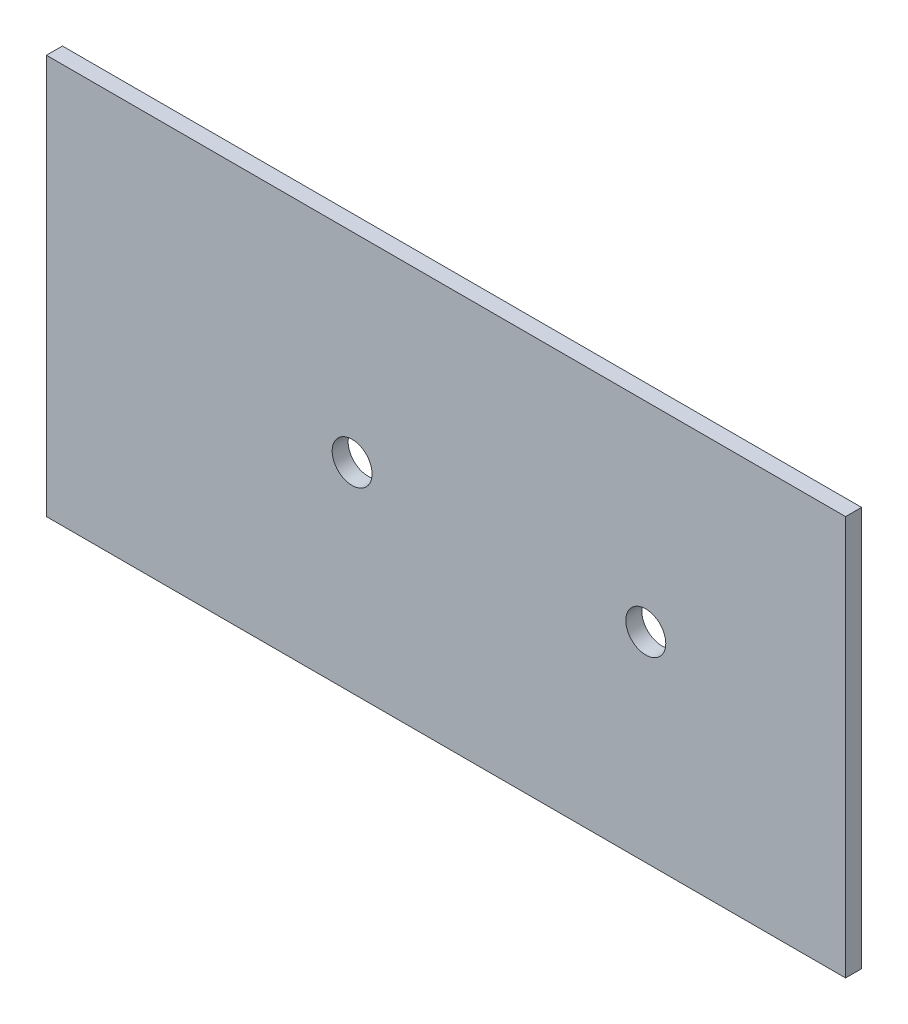
ISO-10303-21;
HEADER;
FILE_DESCRIPTION(('STEP AP214'),'2;1');
FILE_NAME('part.step','',(''),(''),'','','');
FILE_SCHEMA(('AUTOMOTIVE_DESIGN { 1 0 10303 214 1 1 1 1 }'));
ENDSEC;
DATA;
#1=APPLICATION_CONTEXT('core data for automotive mechanical design processes');
#2=APPLICATION_PROTOCOL_DEFINITION('international standard','automotive_design',2000,#1);
#3=PRODUCT_CONTEXT('',#1,'mechanical');
#4=PRODUCT('Part','Part','',(#3));
#5=PRODUCT_RELATED_PRODUCT_CATEGORY('part','',(#4));
#6=PRODUCT_DEFINITION_FORMATION('','',#4);
#7=PRODUCT_DEFINITION_CONTEXT('part definition',#1,'design');
#8=PRODUCT_DEFINITION('design','',#6,#7);
#9=PRODUCT_DEFINITION_SHAPE('','',#8);
#10=(LENGTH_UNIT() NAMED_UNIT(*) SI_UNIT(.MILLI.,.METRE.));
#11=(NAMED_UNIT(*) PLANE_ANGLE_UNIT() SI_UNIT($,.RADIAN.));
#12=(NAMED_UNIT(*) SI_UNIT($,.STERADIAN.) SOLID_ANGLE_UNIT());
#13=UNCERTAINTY_MEASURE_WITH_UNIT(LENGTH_MEASURE(1.E-05),#10,'distance_accuracy_value','');
#14=(GEOMETRIC_REPRESENTATION_CONTEXT(3) GLOBAL_UNCERTAINTY_ASSIGNED_CONTEXT((#13)) GLOBAL_UNIT_ASSIGNED_CONTEXT((#10,
#11,#12)) REPRESENTATION_CONTEXT('',''));
#15=CARTESIAN_POINT('',(0.,0.,0.));
#16=DIRECTION('',(0.,0.,1.));
#17=DIRECTION('',(1.,0.,0.));
#18=AXIS2_PLACEMENT_3D('',#15,#16,#17);
#19=CARTESIAN_POINT('',(0.,0.,4.));
#20=DIRECTION('',(0.,0.,-1.));
#21=DIRECTION('',(-1.,0.,0.));
#22=AXIS2_PLACEMENT_3D('',#19,#20,#21);
#23=PLANE('',#22);
#24=DIRECTION('',(0.,1.,0.));
#25=VECTOR('',#24,1.);
#26=CARTESIAN_POINT('',(50.,-50.,4.));
#27=LINE('',#26,#25);
#28=CARTESIAN_POINT('',(50.,-50.,4.));
#29=VERTEX_POINT('',#28);
#30=CARTESIAN_POINT('',(50.,50.,4.));
#31=VERTEX_POINT('',#30);
#32=EDGE_CURVE('E85',#29,#31,#27,.T.);
#33=ORIENTED_EDGE('',*,*,#32,.T.);
#34=DIRECTION('',(-1.,0.,0.));
#35=VECTOR('',#34,1.);
#36=CARTESIAN_POINT('',(-150.,50.,4.));
#37=LINE('',#36,#35);
#38=CARTESIAN_POINT('',(-150.,50.,4.));
#39=VERTEX_POINT('',#38);
#40=EDGE_CURVE('E80',#31,#39,#37,.T.);
#41=ORIENTED_EDGE('',*,*,#40,.T.);
#42=DIRECTION('',(0.,-1.,0.));
#43=VECTOR('',#42,1.);
#44=CARTESIAN_POINT('',(-150.,-50.,4.));
#45=LINE('',#44,#43);
#46=CARTESIAN_POINT('',(-150.,-50.,4.));
#47=VERTEX_POINT('',#46);
#48=EDGE_CURVE('E83',#39,#47,#45,.T.);
#49=ORIENTED_EDGE('',*,*,#48,.T.);
#50=DIRECTION('',(1.,0.,0.));
#51=VECTOR('',#50,1.);
#52=CARTESIAN_POINT('',(-150.,-50.,4.));
#53=LINE('',#52,#51);
#54=EDGE_CURVE('E50',#47,#29,#53,.T.);
#55=ORIENTED_EDGE('',*,*,#54,.T.);
#56=EDGE_LOOP('',(#33,#41,#49,#55));
#57=FACE_BOUND('',#56,.T.);
#58=CARTESIAN_POINT('',(0.,0.,4.));
#59=DIRECTION('',(0.,0.,1.));
#60=DIRECTION('',(1.,0.,0.));
#61=AXIS2_PLACEMENT_3D('',#58,#59,#60);
#62=CIRCLE('',#61,5.);
#63=CARTESIAN_POINT('',(5.,0.,4.));
#64=VERTEX_POINT('',#63);
#65=EDGE_CURVE('E100',#64,#64,#62,.T.);
#66=ORIENTED_EDGE('',*,*,#65,.F.);
#67=EDGE_LOOP('',(#66));
#68=FACE_BOUND('',#67,.T.);
#69=CARTESIAN_POINT('',(-73.5,0.,4.));
#70=DIRECTION('',(0.,0.,1.));
#71=DIRECTION('',(1.,0.,0.));
#72=AXIS2_PLACEMENT_3D('',#69,#70,#71);
#73=CIRCLE('',#72,5.);
#74=CARTESIAN_POINT('',(-68.5,0.,4.));
#75=VERTEX_POINT('',#74);
#76=EDGE_CURVE('E115',#75,#75,#73,.T.);
#77=ORIENTED_EDGE('',*,*,#76,.F.);
#78=EDGE_LOOP('',(#77));
#79=FACE_BOUND('',#78,.T.);
#80=ADVANCED_FACE('F33',(#57,#68,#79),#23,.F.);
#81=CARTESIAN_POINT('',(0.,0.,0.));
#82=DIRECTION('',(0.,0.,-1.));
#83=DIRECTION('',(-1.,0.,0.));
#84=AXIS2_PLACEMENT_3D('',#81,#82,#83);
#85=PLANE('',#84);
#86=CARTESIAN_POINT('',(0.,0.,0.));
#87=DIRECTION('',(0.,0.,1.));
#88=DIRECTION('',(1.,0.,0.));
#89=AXIS2_PLACEMENT_3D('',#86,#87,#88);
#90=CIRCLE('',#89,5.);
#91=CARTESIAN_POINT('',(5.,0.,0.));
#92=VERTEX_POINT('',#91);
#93=EDGE_CURVE('E112',#92,#92,#90,.T.);
#94=ORIENTED_EDGE('',*,*,#93,.T.);
#95=EDGE_LOOP('',(#94));
#96=FACE_BOUND('',#95,.T.);
#97=DIRECTION('',(0.,1.,0.));
#98=VECTOR('',#97,1.);
#99=CARTESIAN_POINT('',(50.,-50.,0.));
#100=LINE('',#99,#98);
#101=CARTESIAN_POINT('',(50.,-50.,0.));
#102=VERTEX_POINT('',#101);
#103=CARTESIAN_POINT('',(50.,50.,0.));
#104=VERTEX_POINT('',#103);
#105=EDGE_CURVE('E97',#102,#104,#100,.T.);
#106=ORIENTED_EDGE('',*,*,#105,.F.);
#107=DIRECTION('',(1.,0.,0.));
#108=VECTOR('',#107,1.);
#109=CARTESIAN_POINT('',(-150.,-50.,0.));
#110=LINE('',#109,#108);
#111=CARTESIAN_POINT('',(-150.,-50.,0.));
#112=VERTEX_POINT('',#111);
#113=EDGE_CURVE('E73',#112,#102,#110,.T.);
#114=ORIENTED_EDGE('',*,*,#113,.F.);
#115=DIRECTION('',(0.,-1.,0.));
#116=VECTOR('',#115,1.);
#117=CARTESIAN_POINT('',(-150.,-50.,0.));
#118=LINE('',#117,#116);
#119=CARTESIAN_POINT('',(-150.,50.,0.));
#120=VERTEX_POINT('',#119);
#121=EDGE_CURVE('E67',#120,#112,#118,.T.);
#122=ORIENTED_EDGE('',*,*,#121,.F.);
#123=DIRECTION('',(-1.,0.,0.));
#124=VECTOR('',#123,1.);
#125=CARTESIAN_POINT('',(-150.,50.,0.));
#126=LINE('',#125,#124);
#127=EDGE_CURVE('E89',#104,#120,#126,.T.);
#128=ORIENTED_EDGE('',*,*,#127,.F.);
#129=EDGE_LOOP('',(#106,#114,#122,#128));
#130=FACE_BOUND('',#129,.T.);
#131=CARTESIAN_POINT('',(-73.5,0.,0.));
#132=DIRECTION('',(0.,0.,1.));
#133=DIRECTION('',(1.,0.,0.));
#134=AXIS2_PLACEMENT_3D('',#131,#132,#133);
#135=CIRCLE('',#134,5.);
#136=CARTESIAN_POINT('',(-68.5,0.,0.));
#137=VERTEX_POINT('',#136);
#138=EDGE_CURVE('E118',#137,#137,#135,.T.);
#139=ORIENTED_EDGE('',*,*,#138,.T.);
#140=EDGE_LOOP('',(#139));
#141=FACE_BOUND('',#140,.T.);
#142=ADVANCED_FACE('F108',(#96,#130,#141),#85,.T.);
#143=CARTESIAN_POINT('',(50.,-50.,4.));
#144=DIRECTION('',(-1.,0.,0.));
#145=DIRECTION('',(0.,0.,1.));
#146=AXIS2_PLACEMENT_3D('',#143,#144,#145);
#147=PLANE('',#146);
#148=ORIENTED_EDGE('',*,*,#105,.T.);
#149=DIRECTION('',(0.,0.,-1.));
#150=VECTOR('',#149,1.);
#151=CARTESIAN_POINT('',(50.,50.,4.));
#152=LINE('',#151,#150);
#153=EDGE_CURVE('E11',#31,#104,#152,.T.);
#154=ORIENTED_EDGE('',*,*,#153,.F.);
#155=ORIENTED_EDGE('',*,*,#32,.F.);
#156=DIRECTION('',(0.,0.,-1.));
#157=VECTOR('',#156,1.);
#158=CARTESIAN_POINT('',(50.,-50.,4.));
#159=LINE('',#158,#157);
#160=EDGE_CURVE('E93',#29,#102,#159,.T.);
#161=ORIENTED_EDGE('',*,*,#160,.T.);
#162=EDGE_LOOP('',(#148,#154,#155,#161));
#163=FACE_BOUND('',#162,.T.);
#164=ADVANCED_FACE('F35',(#163),#147,.F.);
#165=CARTESIAN_POINT('',(-150.,50.,4.));
#166=DIRECTION('',(0.,-1.,0.));
#167=DIRECTION('',(0.,0.,-1.));
#168=AXIS2_PLACEMENT_3D('',#165,#166,#167);
#169=PLANE('',#168);
#170=ORIENTED_EDGE('',*,*,#127,.T.);
#171=DIRECTION('',(0.,0.,-1.));
#172=VECTOR('',#171,1.);
#173=CARTESIAN_POINT('',(-150.,50.,4.));
#174=LINE('',#173,#172);
#175=EDGE_CURVE('E42',#39,#120,#174,.T.);
#176=ORIENTED_EDGE('',*,*,#175,.F.);
#177=ORIENTED_EDGE('',*,*,#40,.F.);
#178=ORIENTED_EDGE('',*,*,#153,.T.);
#179=EDGE_LOOP('',(#170,#176,#177,#178));
#180=FACE_BOUND('',#179,.T.);
#181=ADVANCED_FACE('F88',(#180),#169,.F.);
#182=CARTESIAN_POINT('',(-150.,-50.,4.));
#183=DIRECTION('',(1.,0.,0.));
#184=DIRECTION('',(0.,0.,-1.));
#185=AXIS2_PLACEMENT_3D('',#182,#183,#184);
#186=PLANE('',#185);
#187=ORIENTED_EDGE('',*,*,#121,.T.);
#188=DIRECTION('',(0.,0.,-1.));
#189=VECTOR('',#188,1.);
#190=CARTESIAN_POINT('',(-150.,-50.,4.));
#191=LINE('',#190,#189);
#192=EDGE_CURVE('E90',#47,#112,#191,.T.);
#193=ORIENTED_EDGE('',*,*,#192,.F.);
#194=ORIENTED_EDGE('',*,*,#48,.F.);
#195=ORIENTED_EDGE('',*,*,#175,.T.);
#196=EDGE_LOOP('',(#187,#193,#194,#195));
#197=FACE_BOUND('',#196,.T.);
#198=ADVANCED_FACE('F91',(#197),#186,.F.);
#199=CARTESIAN_POINT('',(-150.,-50.,4.));
#200=DIRECTION('',(0.,1.,0.));
#201=DIRECTION('',(0.,0.,1.));
#202=AXIS2_PLACEMENT_3D('',#199,#200,#201);
#203=PLANE('',#202);
#204=ORIENTED_EDGE('',*,*,#113,.T.);
#205=ORIENTED_EDGE('',*,*,#160,.F.);
#206=ORIENTED_EDGE('',*,*,#54,.F.);
#207=ORIENTED_EDGE('',*,*,#192,.T.);
#208=EDGE_LOOP('',(#204,#205,#206,#207));
#209=FACE_BOUND('',#208,.T.);
#210=ADVANCED_FACE('F105',(#209),#203,.F.);
#211=CARTESIAN_POINT('',(0.,0.,4.));
#212=DIRECTION('',(0.,0.,-1.));
#213=DIRECTION('',(-1.,0.,0.));
#214=AXIS2_PLACEMENT_3D('',#211,#212,#213);
#215=CYLINDRICAL_SURFACE('',#214,5.);
#216=ORIENTED_EDGE('',*,*,#65,.T.);
#217=EDGE_LOOP('',(#216));
#218=FACE_BOUND('',#217,.T.);
#219=ORIENTED_EDGE('',*,*,#93,.F.);
#220=EDGE_LOOP('',(#219));
#221=FACE_BOUND('',#220,.T.);
#222=ADVANCED_FACE('F135',(#218,#221),#215,.F.);
#223=CARTESIAN_POINT('',(-73.5,0.,4.));
#224=DIRECTION('',(0.,0.,-1.));
#225=DIRECTION('',(-1.,0.,0.));
#226=AXIS2_PLACEMENT_3D('',#223,#224,#225);
#227=CYLINDRICAL_SURFACE('',#226,5.);
#228=ORIENTED_EDGE('',*,*,#76,.T.);
#229=EDGE_LOOP('',(#228));
#230=FACE_BOUND('',#229,.T.);
#231=ORIENTED_EDGE('',*,*,#138,.F.);
#232=EDGE_LOOP('',(#231));
#233=FACE_BOUND('',#232,.T.);
#234=ADVANCED_FACE('F124',(#230,#233),#227,.F.);
#235=CLOSED_SHELL('',(#80,#142,#164,#181,#198,#210,#222,#234));
#236=MANIFOLD_SOLID_BREP('B2',#235);
#237=ADVANCED_BREP_SHAPE_REPRESENTATION('',(#18,#236),#14);
#238=SHAPE_DEFINITION_REPRESENTATION(#9,#237);
ENDSEC;
END-ISO-10303-21;
